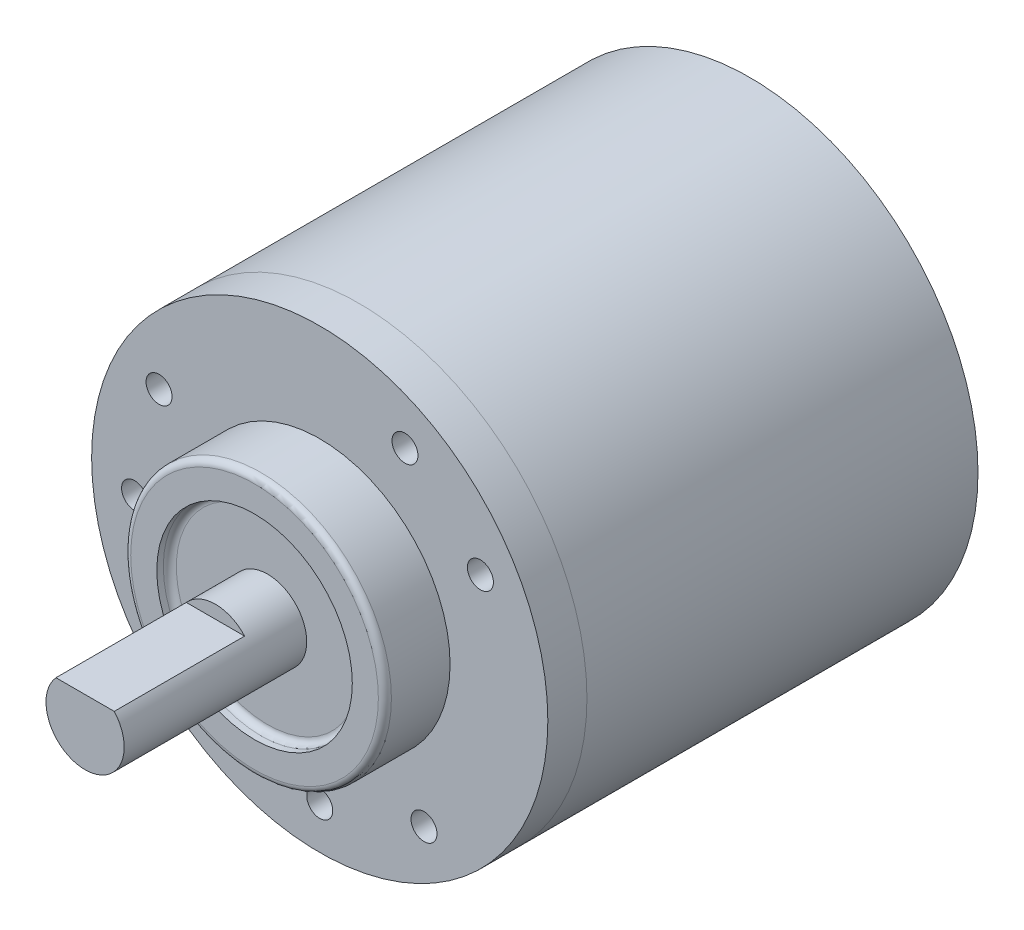
ISO-10303-21;
HEADER;
FILE_DESCRIPTION(('STEP AP214'),'2;1');
FILE_NAME('part.step','',(''),(''),'','','');
FILE_SCHEMA(('AUTOMOTIVE_DESIGN { 1 0 10303 214 1 1 1 1 }'));
ENDSEC;
DATA;
#1=APPLICATION_CONTEXT('core data for automotive mechanical design processes');
#2=APPLICATION_PROTOCOL_DEFINITION('international standard','automotive_design',2000,#1);
#3=PRODUCT_CONTEXT('',#1,'mechanical');
#4=PRODUCT('Part','Part','',(#3));
#5=PRODUCT_RELATED_PRODUCT_CATEGORY('part','',(#4));
#6=PRODUCT_DEFINITION_FORMATION('','',#4);
#7=PRODUCT_DEFINITION_CONTEXT('part definition',#1,'design');
#8=PRODUCT_DEFINITION('design','',#6,#7);
#9=PRODUCT_DEFINITION_SHAPE('','',#8);
#10=(LENGTH_UNIT() NAMED_UNIT(*) SI_UNIT(.MILLI.,.METRE.));
#11=(NAMED_UNIT(*) PLANE_ANGLE_UNIT() SI_UNIT($,.RADIAN.));
#12=(NAMED_UNIT(*) SI_UNIT($,.STERADIAN.) SOLID_ANGLE_UNIT());
#13=UNCERTAINTY_MEASURE_WITH_UNIT(LENGTH_MEASURE(1.E-05),#10,'distance_accuracy_value','');
#14=(GEOMETRIC_REPRESENTATION_CONTEXT(3) GLOBAL_UNCERTAINTY_ASSIGNED_CONTEXT((#13)) GLOBAL_UNIT_ASSIGNED_CONTEXT((#10,
#11,#12)) REPRESENTATION_CONTEXT('',''));
#15=CARTESIAN_POINT('',(0.,0.,0.));
#16=DIRECTION('',(0.,0.,1.));
#17=DIRECTION('',(1.,0.,0.));
#18=AXIS2_PLACEMENT_3D('',#15,#16,#17);
#19=CARTESIAN_POINT('',(0.,0.,37.));
#20=DIRECTION('',(0.,0.,1.));
#21=DIRECTION('',(1.,0.,0.));
#22=AXIS2_PLACEMENT_3D('',#19,#20,#21);
#23=PLANE('',#22);
#24=CARTESIAN_POINT('',(0.,0.,37.));
#25=DIRECTION('',(0.,0.,1.));
#26=DIRECTION('',(1.,0.,0.));
#27=AXIS2_PLACEMENT_3D('',#24,#25,#26);
#28=CIRCLE('',#27,7.);
#29=CARTESIAN_POINT('',(7.,0.,37.));
#30=VERTEX_POINT('',#29);
#31=EDGE_CURVE('E153',#30,#30,#28,.T.);
#32=ORIENTED_EDGE('',*,*,#31,.T.);
#33=EDGE_LOOP('',(#32));
#34=FACE_BOUND('',#33,.T.);
#35=CARTESIAN_POINT('',(0.,0.,37.));
#36=DIRECTION('',(0.,0.,1.));
#37=DIRECTION('',(1.,0.,0.));
#38=AXIS2_PLACEMENT_3D('',#35,#36,#37);
#39=CIRCLE('',#38,3.);
#40=CARTESIAN_POINT('',(3.,0.,37.));
#41=VERTEX_POINT('',#40);
#42=EDGE_CURVE('E84',#41,#41,#39,.T.);
#43=ORIENTED_EDGE('',*,*,#42,.F.);
#44=EDGE_LOOP('',(#43));
#45=FACE_BOUND('',#44,.T.);
#46=ADVANCED_FACE('F49',(#34,#45),#23,.T.);
#47=CARTESIAN_POINT('',(0.,0.,33.));
#48=DIRECTION('',(0.,0.,1.));
#49=DIRECTION('',(1.,0.,0.));
#50=AXIS2_PLACEMENT_3D('',#47,#48,#49);
#51=PLANE('',#50);
#52=CARTESIAN_POINT('',(0.,-14.2329837612549,33.));
#53=DIRECTION('',(0.,0.,1.));
#54=DIRECTION('',(1.,0.,0.));
#55=AXIS2_PLACEMENT_3D('',#52,#53,#54);
#56=CIRCLE('',#55,0.99694999999999);
#57=CARTESIAN_POINT('',(0.99694999999999,-14.2329837612549,33.));
#58=VERTEX_POINT('',#57);
#59=EDGE_CURVE('E354',#58,#58,#56,.T.);
#60=ORIENTED_EDGE('',*,*,#59,.F.);
#61=EDGE_LOOP('',(#60));
#62=FACE_BOUND('',#61,.T.);
#63=CARTESIAN_POINT('',(8.,-11.771908373248,33.));
#64=DIRECTION('',(0.,0.,1.));
#65=DIRECTION('',(1.,0.,0.));
#66=AXIS2_PLACEMENT_3D('',#63,#64,#65);
#67=CIRCLE('',#66,0.99694999999999);
#68=CARTESIAN_POINT('',(8.99694999999999,-11.771908373248,33.));
#69=VERTEX_POINT('',#68);
#70=EDGE_CURVE('E126',#69,#69,#67,.T.);
#71=ORIENTED_EDGE('',*,*,#70,.F.);
#72=EDGE_LOOP('',(#71));
#73=FACE_BOUND('',#72,.T.);
#74=CARTESIAN_POINT('',(12.3261255088982,7.11649188062735,33.));
#75=DIRECTION('',(0.,0.,1.));
#76=DIRECTION('',(1.,0.,0.));
#77=AXIS2_PLACEMENT_3D('',#74,#75,#76);
#78=CIRCLE('',#77,0.99694999999999);
#79=CARTESIAN_POINT('',(13.3230755088982,7.11649188062735,33.));
#80=VERTEX_POINT('',#79);
#81=EDGE_CURVE('E115',#80,#80,#78,.T.);
#82=ORIENTED_EDGE('',*,*,#81,.F.);
#83=EDGE_LOOP('',(#82));
#84=FACE_BOUND('',#83,.T.);
#85=CARTESIAN_POINT('',(6.54025432352957,12.6413171834148,33.));
#86=DIRECTION('',(0.,0.,1.));
#87=DIRECTION('',(1.,0.,0.));
#88=AXIS2_PLACEMENT_3D('',#85,#86,#87);
#89=CIRCLE('',#88,0.99694999999999);
#90=CARTESIAN_POINT('',(7.53720432352956,12.6413171834148,33.));
#91=VERTEX_POINT('',#90);
#92=EDGE_CURVE('E112',#91,#91,#89,.T.);
#93=ORIENTED_EDGE('',*,*,#92,.F.);
#94=EDGE_LOOP('',(#93));
#95=FACE_BOUND('',#94,.T.);
#96=CARTESIAN_POINT('',(-12.3261255088982,7.11649188062734,33.));
#97=DIRECTION('',(0.,0.,1.));
#98=DIRECTION('',(1.,0.,0.));
#99=AXIS2_PLACEMENT_3D('',#96,#97,#98);
#100=CIRCLE('',#99,0.99694999999999);
#101=CARTESIAN_POINT('',(-11.3291755088982,7.11649188062734,33.));
#102=VERTEX_POINT('',#101);
#103=EDGE_CURVE('E111',#102,#102,#100,.T.);
#104=ORIENTED_EDGE('',*,*,#103,.F.);
#105=EDGE_LOOP('',(#104));
#106=FACE_BOUND('',#105,.T.);
#107=CARTESIAN_POINT('',(-14.2055355460873,-0.883508119372653,33.));
#108=DIRECTION('',(0.,0.,1.));
#109=DIRECTION('',(1.,0.,0.));
#110=AXIS2_PLACEMENT_3D('',#107,#108,#109);
#111=CIRCLE('',#110,0.99694999999999);
#112=CARTESIAN_POINT('',(-13.2085855460873,-0.883508119372653,33.));
#113=VERTEX_POINT('',#112);
#114=EDGE_CURVE('E135',#113,#113,#111,.T.);
#115=ORIENTED_EDGE('',*,*,#114,.F.);
#116=EDGE_LOOP('',(#115));
#117=FACE_BOUND('',#116,.T.);
#118=CARTESIAN_POINT('',(0.,0.,33.));
#119=DIRECTION('',(0.,0.,1.));
#120=DIRECTION('',(1.,0.,0.));
#121=AXIS2_PLACEMENT_3D('',#118,#119,#120);
#122=CIRCLE('',#121,17.5);
#123=CARTESIAN_POINT('',(17.5,0.,33.));
#124=VERTEX_POINT('',#123);
#125=EDGE_CURVE('E150',#124,#124,#122,.T.);
#126=ORIENTED_EDGE('',*,*,#125,.T.);
#127=EDGE_LOOP('',(#126));
#128=FACE_BOUND('',#127,.T.);
#129=CARTESIAN_POINT('',(0.,0.,33.));
#130=DIRECTION('',(0.,0.,1.));
#131=DIRECTION('',(1.,0.,0.));
#132=AXIS2_PLACEMENT_3D('',#129,#130,#131);
#133=CIRCLE('',#132,10.);
#134=CARTESIAN_POINT('',(10.,0.,33.));
#135=VERTEX_POINT('',#134);
#136=EDGE_CURVE('E146',#135,#135,#133,.T.);
#137=ORIENTED_EDGE('',*,*,#136,.F.);
#138=EDGE_LOOP('',(#137));
#139=FACE_BOUND('',#138,.T.);
#140=ADVANCED_FACE('F172',(#62,#73,#84,#95,#106,#117,#128,#139),#51,.T.);
#141=CARTESIAN_POINT('',(0.,0.,33.));
#142=DIRECTION('',(0.,0.,-1.));
#143=DIRECTION('',(-1.,0.,0.));
#144=AXIS2_PLACEMENT_3D('',#141,#142,#143);
#145=CYLINDRICAL_SURFACE('',#144,17.5);
#146=ORIENTED_EDGE('',*,*,#125,.F.);
#147=EDGE_LOOP('',(#146));
#148=FACE_BOUND('',#147,.T.);
#149=CARTESIAN_POINT('',(0.,0.,30.));
#150=DIRECTION('',(0.,0.,1.));
#151=DIRECTION('',(1.,0.,0.));
#152=AXIS2_PLACEMENT_3D('',#149,#150,#151);
#153=CIRCLE('',#152,17.5);
#154=CARTESIAN_POINT('',(17.5,0.,30.));
#155=VERTEX_POINT('',#154);
#156=EDGE_CURVE('E149',#155,#155,#153,.T.);
#157=ORIENTED_EDGE('',*,*,#156,.T.);
#158=EDGE_LOOP('',(#157));
#159=FACE_BOUND('',#158,.T.);
#160=ADVANCED_FACE('F196',(#148,#159),#145,.T.);
#161=CARTESIAN_POINT('',(0.,0.,30.));
#162=DIRECTION('',(0.,0.,1.));
#163=DIRECTION('',(1.,0.,0.));
#164=AXIS2_PLACEMENT_3D('',#161,#162,#163);
#165=PLANE('',#164);
#166=CARTESIAN_POINT('',(0.,-14.2329837612549,30.));
#167=DIRECTION('',(0.,0.,1.));
#168=DIRECTION('',(1.,0.,0.));
#169=AXIS2_PLACEMENT_3D('',#166,#167,#168);
#170=CIRCLE('',#169,0.996949999999988);
#171=CARTESIAN_POINT('',(0.996949999999988,-14.2329837612549,30.));
#172=VERTEX_POINT('',#171);
#173=EDGE_CURVE('E53',#172,#172,#170,.T.);
#174=ORIENTED_EDGE('',*,*,#173,.T.);
#175=EDGE_LOOP('',(#174));
#176=FACE_BOUND('',#175,.T.);
#177=CARTESIAN_POINT('',(8.,-11.771908373248,30.));
#178=DIRECTION('',(0.,0.,1.));
#179=DIRECTION('',(1.,0.,0.));
#180=AXIS2_PLACEMENT_3D('',#177,#178,#179);
#181=CIRCLE('',#180,0.996949999999988);
#182=CARTESIAN_POINT('',(8.99694999999999,-11.771908373248,30.));
#183=VERTEX_POINT('',#182);
#184=EDGE_CURVE('E121',#183,#183,#181,.T.);
#185=ORIENTED_EDGE('',*,*,#184,.T.);
#186=EDGE_LOOP('',(#185));
#187=FACE_BOUND('',#186,.T.);
#188=CARTESIAN_POINT('',(12.3261255088982,7.11649188062735,30.));
#189=DIRECTION('',(0.,0.,1.));
#190=DIRECTION('',(1.,0.,0.));
#191=AXIS2_PLACEMENT_3D('',#188,#189,#190);
#192=CIRCLE('',#191,0.996949999999989);
#193=CARTESIAN_POINT('',(13.3230755088982,7.11649188062735,30.));
#194=VERTEX_POINT('',#193);
#195=EDGE_CURVE('E113',#194,#194,#192,.T.);
#196=ORIENTED_EDGE('',*,*,#195,.T.);
#197=EDGE_LOOP('',(#196));
#198=FACE_BOUND('',#197,.T.);
#199=CARTESIAN_POINT('',(6.54025432352957,12.6413171834148,30.));
#200=DIRECTION('',(0.,0.,1.));
#201=DIRECTION('',(1.,0.,0.));
#202=AXIS2_PLACEMENT_3D('',#199,#200,#201);
#203=CIRCLE('',#202,0.996949999999988);
#204=CARTESIAN_POINT('',(7.53720432352956,12.6413171834148,30.));
#205=VERTEX_POINT('',#204);
#206=EDGE_CURVE('E109',#205,#205,#203,.T.);
#207=ORIENTED_EDGE('',*,*,#206,.T.);
#208=EDGE_LOOP('',(#207));
#209=FACE_BOUND('',#208,.T.);
#210=CARTESIAN_POINT('',(-12.3261255088982,7.11649188062734,30.));
#211=DIRECTION('',(0.,0.,1.));
#212=DIRECTION('',(1.,0.,0.));
#213=AXIS2_PLACEMENT_3D('',#210,#211,#212);
#214=CIRCLE('',#213,0.996949999999989);
#215=CARTESIAN_POINT('',(-11.3291755088982,7.11649188062734,30.));
#216=VERTEX_POINT('',#215);
#217=EDGE_CURVE('E132',#216,#216,#214,.T.);
#218=ORIENTED_EDGE('',*,*,#217,.T.);
#219=EDGE_LOOP('',(#218));
#220=FACE_BOUND('',#219,.T.);
#221=CARTESIAN_POINT('',(-14.2055355460873,-0.883508119372653,30.));
#222=DIRECTION('',(0.,0.,1.));
#223=DIRECTION('',(1.,0.,0.));
#224=AXIS2_PLACEMENT_3D('',#221,#222,#223);
#225=CIRCLE('',#224,0.996949999999988);
#226=CARTESIAN_POINT('',(-13.2085855460873,-0.883508119372653,30.));
#227=VERTEX_POINT('',#226);
#228=EDGE_CURVE('E92',#227,#227,#225,.T.);
#229=ORIENTED_EDGE('',*,*,#228,.T.);
#230=EDGE_LOOP('',(#229));
#231=FACE_BOUND('',#230,.T.);
#232=ORIENTED_EDGE('',*,*,#156,.F.);
#233=EDGE_LOOP('',(#232));
#234=FACE_BOUND('',#233,.T.);
#235=ADVANCED_FACE('F192',(#176,#187,#198,#209,#220,#231,#234),#165,.F.);
#236=CARTESIAN_POINT('',(0.,0.,38.));
#237=DIRECTION('',(0.,0.,-1.));
#238=DIRECTION('',(-1.,0.,0.));
#239=AXIS2_PLACEMENT_3D('',#236,#237,#238);
#240=CYLINDRICAL_SURFACE('',#239,10.);
#241=CARTESIAN_POINT('',(0.,0.,37.5));
#242=DIRECTION('',(0.,0.,1.));
#243=DIRECTION('',(1.,0.,0.));
#244=AXIS2_PLACEMENT_3D('',#241,#242,#243);
#245=CIRCLE('',#244,10.);
#246=CARTESIAN_POINT('',(10.,0.,37.5));
#247=VERTEX_POINT('',#246);
#248=EDGE_CURVE('E12',#247,#247,#245,.F.);
#249=ORIENTED_EDGE('',*,*,#248,.T.);
#250=EDGE_LOOP('',(#249));
#251=FACE_BOUND('',#250,.T.);
#252=ORIENTED_EDGE('',*,*,#136,.T.);
#253=EDGE_LOOP('',(#252));
#254=FACE_BOUND('',#253,.T.);
#255=ADVANCED_FACE('F188',(#251,#254),#240,.T.);
#256=CARTESIAN_POINT('',(0.,0.,38.));
#257=DIRECTION('',(0.,0.,1.));
#258=DIRECTION('',(1.,0.,0.));
#259=AXIS2_PLACEMENT_3D('',#256,#257,#258);
#260=PLANE('',#259);
#261=CARTESIAN_POINT('',(0.,0.,38.));
#262=DIRECTION('',(0.,0.,1.));
#263=DIRECTION('',(1.,0.,0.));
#264=AXIS2_PLACEMENT_3D('',#261,#262,#263);
#265=CIRCLE('',#264,9.5);
#266=CARTESIAN_POINT('',(9.5,0.,38.));
#267=VERTEX_POINT('',#266);
#268=EDGE_CURVE('E58',#267,#267,#265,.T.);
#269=ORIENTED_EDGE('',*,*,#268,.T.);
#270=EDGE_LOOP('',(#269));
#271=FACE_BOUND('',#270,.T.);
#272=CARTESIAN_POINT('',(0.,0.,38.));
#273=DIRECTION('',(0.,0.,1.));
#274=DIRECTION('',(1.,0.,0.));
#275=AXIS2_PLACEMENT_3D('',#272,#273,#274);
#276=CIRCLE('',#275,7.5);
#277=CARTESIAN_POINT('',(7.5,0.,38.));
#278=VERTEX_POINT('',#277);
#279=EDGE_CURVE('E83',#278,#278,#276,.T.);
#280=ORIENTED_EDGE('',*,*,#279,.F.);
#281=EDGE_LOOP('',(#280));
#282=FACE_BOUND('',#281,.T.);
#283=ADVANCED_FACE('F185',(#271,#282),#260,.T.);
#284=CARTESIAN_POINT('',(0.,0.,37.));
#285=DIRECTION('',(0.,0.,1.));
#286=DIRECTION('',(1.,0.,0.));
#287=AXIS2_PLACEMENT_3D('',#284,#285,#286);
#288=CYLINDRICAL_SURFACE('',#287,7.5);
#289=CARTESIAN_POINT('',(0.,0.,37.5));
#290=DIRECTION('',(0.,0.,1.));
#291=DIRECTION('',(1.,0.,0.));
#292=AXIS2_PLACEMENT_3D('',#289,#290,#291);
#293=CIRCLE('',#292,7.5);
#294=CARTESIAN_POINT('',(7.5,0.,37.5));
#295=VERTEX_POINT('',#294);
#296=EDGE_CURVE('E107',#295,#295,#293,.F.);
#297=ORIENTED_EDGE('',*,*,#296,.T.);
#298=EDGE_LOOP('',(#297));
#299=FACE_BOUND('',#298,.T.);
#300=ORIENTED_EDGE('',*,*,#279,.T.);
#301=EDGE_LOOP('',(#300));
#302=FACE_BOUND('',#301,.T.);
#303=ADVANCED_FACE('F162',(#299,#302),#288,.F.);
#304=CARTESIAN_POINT('',(0.,0.,37.5));
#305=DIRECTION('',(0.,0.,1.));
#306=DIRECTION('',(1.,0.,0.));
#307=AXIS2_PLACEMENT_3D('',#304,#305,#306);
#308=TOROIDAL_SURFACE('',#307,7.,0.5);
#309=ORIENTED_EDGE('',*,*,#296,.F.);
#310=EDGE_LOOP('',(#309));
#311=FACE_BOUND('',#310,.T.);
#312=ORIENTED_EDGE('',*,*,#31,.F.);
#313=EDGE_LOOP('',(#312));
#314=FACE_BOUND('',#313,.T.);
#315=ADVANCED_FACE('F165',(#311,#314),#308,.F.);
#316=CARTESIAN_POINT('',(0.,0.,41.));
#317=DIRECTION('',(0.,0.,-1.));
#318=DIRECTION('',(-1.,0.,0.));
#319=AXIS2_PLACEMENT_3D('',#316,#317,#318);
#320=CYLINDRICAL_SURFACE('',#319,3.);
#321=CARTESIAN_POINT('',(0.,0.,41.));
#322=DIRECTION('',(0.,0.,1.));
#323=DIRECTION('',(1.,0.,0.));
#324=AXIS2_PLACEMENT_3D('',#321,#322,#323);
#325=CIRCLE('',#324,3.);
#326=CARTESIAN_POINT('',(2.23606797749979,2.,41.));
#327=VERTEX_POINT('',#326);
#328=CARTESIAN_POINT('',(-2.23606797749979,2.,41.));
#329=VERTEX_POINT('',#328);
#330=EDGE_CURVE('E77',#327,#329,#325,.T.);
#331=ORIENTED_EDGE('',*,*,#330,.F.);
#332=DIRECTION('',(0.,0.,-1.));
#333=VECTOR('',#332,1.);
#334=CARTESIAN_POINT('',(2.23606797749979,2.,51.));
#335=LINE('',#334,#333);
#336=CARTESIAN_POINT('',(2.23606797749979,2.,51.));
#337=VERTEX_POINT('',#336);
#338=EDGE_CURVE('E90',#337,#327,#335,.T.);
#339=ORIENTED_EDGE('',*,*,#338,.F.);
#340=CARTESIAN_POINT('',(0.,0.,51.));
#341=DIRECTION('',(0.,0.,1.));
#342=DIRECTION('',(1.,0.,0.));
#343=AXIS2_PLACEMENT_3D('',#340,#341,#342);
#344=CIRCLE('',#343,3.);
#345=CARTESIAN_POINT('',(-2.23606797749979,2.,51.));
#346=VERTEX_POINT('',#345);
#347=EDGE_CURVE('E91',#346,#337,#344,.T.);
#348=ORIENTED_EDGE('',*,*,#347,.F.);
#349=DIRECTION('',(0.,0.,-1.));
#350=VECTOR('',#349,1.);
#351=CARTESIAN_POINT('',(-2.23606797749979,2.,51.));
#352=LINE('',#351,#350);
#353=EDGE_CURVE('E88',#346,#329,#352,.T.);
#354=ORIENTED_EDGE('',*,*,#353,.T.);
#355=EDGE_LOOP('',(#331,#339,#348,#354));
#356=FACE_BOUND('',#355,.T.);
#357=ORIENTED_EDGE('',*,*,#42,.T.);
#358=EDGE_LOOP('',(#357));
#359=FACE_BOUND('',#358,.T.);
#360=ADVANCED_FACE('F94',(#356,#359),#320,.T.);
#361=CARTESIAN_POINT('',(0.,0.,41.));
#362=DIRECTION('',(0.,0.,1.));
#363=DIRECTION('',(1.,0.,0.));
#364=AXIS2_PLACEMENT_3D('',#361,#362,#363);
#365=PLANE('',#364);
#366=DIRECTION('',(-1.,0.,0.));
#367=VECTOR('',#366,1.);
#368=CARTESIAN_POINT('',(-2.23606797749979,2.,41.));
#369=LINE('',#368,#367);
#370=EDGE_CURVE('E65',#327,#329,#369,.T.);
#371=ORIENTED_EDGE('',*,*,#370,.F.);
#372=ORIENTED_EDGE('',*,*,#330,.T.);
#373=EDGE_LOOP('',(#371,#372));
#374=FACE_BOUND('',#373,.T.);
#375=ADVANCED_FACE('F78',(#374),#365,.T.);
#376=CARTESIAN_POINT('',(-2.23606797749979,2.,51.));
#377=DIRECTION('',(0.,-1.,0.));
#378=DIRECTION('',(0.,0.,-1.));
#379=AXIS2_PLACEMENT_3D('',#376,#377,#378);
#380=PLANE('',#379);
#381=ORIENTED_EDGE('',*,*,#370,.T.);
#382=ORIENTED_EDGE('',*,*,#353,.F.);
#383=DIRECTION('',(-1.,0.,0.));
#384=VECTOR('',#383,1.);
#385=CARTESIAN_POINT('',(-2.23606797749979,2.,51.));
#386=LINE('',#385,#384);
#387=EDGE_CURVE('E73',#337,#346,#386,.T.);
#388=ORIENTED_EDGE('',*,*,#387,.F.);
#389=ORIENTED_EDGE('',*,*,#338,.T.);
#390=EDGE_LOOP('',(#381,#382,#388,#389));
#391=FACE_BOUND('',#390,.T.);
#392=ADVANCED_FACE('F87',(#391),#380,.F.);
#393=CARTESIAN_POINT('',(0.,0.,51.));
#394=DIRECTION('',(0.,0.,1.));
#395=DIRECTION('',(1.,0.,0.));
#396=AXIS2_PLACEMENT_3D('',#393,#394,#395);
#397=PLANE('',#396);
#398=ORIENTED_EDGE('',*,*,#347,.T.);
#399=ORIENTED_EDGE('',*,*,#387,.T.);
#400=EDGE_LOOP('',(#398,#399));
#401=FACE_BOUND('',#400,.T.);
#402=ADVANCED_FACE('F263',(#401),#397,.T.);
#403=CARTESIAN_POINT('',(0.,0.,37.5));
#404=DIRECTION('',(0.,0.,1.));
#405=DIRECTION('',(1.,0.,0.));
#406=AXIS2_PLACEMENT_3D('',#403,#404,#405);
#407=TOROIDAL_SURFACE('',#406,9.5,0.5);
#408=ORIENTED_EDGE('',*,*,#248,.F.);
#409=EDGE_LOOP('',(#408));
#410=FACE_BOUND('',#409,.T.);
#411=ORIENTED_EDGE('',*,*,#268,.F.);
#412=EDGE_LOOP('',(#411));
#413=FACE_BOUND('',#412,.T.);
#414=ADVANCED_FACE('F51',(#410,#413),#407,.T.);
#415=CARTESIAN_POINT('',(-14.2055355460873,-0.883508119372653,33.));
#416=DIRECTION('',(0.,0.,1.));
#417=DIRECTION('',(1.,0.,0.));
#418=AXIS2_PLACEMENT_3D('',#415,#416,#417);
#419=CYLINDRICAL_SURFACE('',#418,0.996949999999988);
#420=ORIENTED_EDGE('',*,*,#114,.T.);
#421=EDGE_LOOP('',(#420));
#422=FACE_BOUND('',#421,.T.);
#423=ORIENTED_EDGE('',*,*,#228,.F.);
#424=EDGE_LOOP('',(#423));
#425=FACE_BOUND('',#424,.T.);
#426=ADVANCED_FACE('F278',(#422,#425),#419,.F.);
#427=CARTESIAN_POINT('',(-12.3261255088982,7.11649188062734,33.));
#428=DIRECTION('',(0.,0.,1.));
#429=DIRECTION('',(1.,0.,0.));
#430=AXIS2_PLACEMENT_3D('',#427,#428,#429);
#431=CYLINDRICAL_SURFACE('',#430,0.996949999999989);
#432=ORIENTED_EDGE('',*,*,#103,.T.);
#433=EDGE_LOOP('',(#432));
#434=FACE_BOUND('',#433,.T.);
#435=ORIENTED_EDGE('',*,*,#217,.F.);
#436=EDGE_LOOP('',(#435));
#437=FACE_BOUND('',#436,.T.);
#438=ADVANCED_FACE('F284',(#434,#437),#431,.F.);
#439=CARTESIAN_POINT('',(6.54025432352957,12.6413171834148,33.));
#440=DIRECTION('',(0.,0.,1.));
#441=DIRECTION('',(1.,0.,0.));
#442=AXIS2_PLACEMENT_3D('',#439,#440,#441);
#443=CYLINDRICAL_SURFACE('',#442,0.996949999999988);
#444=ORIENTED_EDGE('',*,*,#92,.T.);
#445=EDGE_LOOP('',(#444));
#446=FACE_BOUND('',#445,.T.);
#447=ORIENTED_EDGE('',*,*,#206,.F.);
#448=EDGE_LOOP('',(#447));
#449=FACE_BOUND('',#448,.T.);
#450=ADVANCED_FACE('F291',(#446,#449),#443,.F.);
#451=CARTESIAN_POINT('',(12.3261255088982,7.11649188062735,33.));
#452=DIRECTION('',(0.,0.,1.));
#453=DIRECTION('',(1.,0.,0.));
#454=AXIS2_PLACEMENT_3D('',#451,#452,#453);
#455=CYLINDRICAL_SURFACE('',#454,0.996949999999989);
#456=ORIENTED_EDGE('',*,*,#81,.T.);
#457=EDGE_LOOP('',(#456));
#458=FACE_BOUND('',#457,.T.);
#459=ORIENTED_EDGE('',*,*,#195,.F.);
#460=EDGE_LOOP('',(#459));
#461=FACE_BOUND('',#460,.T.);
#462=ADVANCED_FACE('F299',(#458,#461),#455,.F.);
#463=CARTESIAN_POINT('',(8.,-11.771908373248,33.));
#464=DIRECTION('',(0.,0.,1.));
#465=DIRECTION('',(1.,0.,0.));
#466=AXIS2_PLACEMENT_3D('',#463,#464,#465);
#467=CYLINDRICAL_SURFACE('',#466,0.996949999999988);
#468=ORIENTED_EDGE('',*,*,#70,.T.);
#469=EDGE_LOOP('',(#468));
#470=FACE_BOUND('',#469,.T.);
#471=ORIENTED_EDGE('',*,*,#184,.F.);
#472=EDGE_LOOP('',(#471));
#473=FACE_BOUND('',#472,.T.);
#474=ADVANCED_FACE('F307',(#470,#473),#467,.F.);
#475=CARTESIAN_POINT('',(0.,-14.2329837612549,33.));
#476=DIRECTION('',(0.,0.,1.));
#477=DIRECTION('',(1.,0.,0.));
#478=AXIS2_PLACEMENT_3D('',#475,#476,#477);
#479=CYLINDRICAL_SURFACE('',#478,0.996949999999988);
#480=ORIENTED_EDGE('',*,*,#59,.T.);
#481=EDGE_LOOP('',(#480));
#482=FACE_BOUND('',#481,.T.);
#483=ORIENTED_EDGE('',*,*,#173,.F.);
#484=EDGE_LOOP('',(#483));
#485=FACE_BOUND('',#484,.T.);
#486=ADVANCED_FACE('F314',(#482,#485),#479,.F.);
#487=CLOSED_SHELL('',(#46,#140,#160,#235,#255,#283,#303,#315,#360,#375,#392,#402,#414,#426,#438,
#450,#462,#474,#486));
#488=MANIFOLD_SOLID_BREP('B2',#487);
#489=CARTESIAN_POINT('',(0.,0.,30.));
#490=DIRECTION('',(0.,0.,-1.));
#491=DIRECTION('',(-1.,0.,0.));
#492=AXIS2_PLACEMENT_3D('',#489,#490,#491);
#493=CYLINDRICAL_SURFACE('',#492,17.5);
#494=CARTESIAN_POINT('',(0.,0.,30.));
#495=DIRECTION('',(0.,0.,1.));
#496=DIRECTION('',(1.,0.,0.));
#497=AXIS2_PLACEMENT_3D('',#494,#495,#496);
#498=CIRCLE('',#497,17.5);
#499=CARTESIAN_POINT('',(17.5,0.,30.));
#500=VERTEX_POINT('',#499);
#501=EDGE_CURVE('E47',#500,#500,#498,.T.);
#502=ORIENTED_EDGE('',*,*,#501,.F.);
#503=EDGE_LOOP('',(#502));
#504=FACE_BOUND('',#503,.T.);
#505=CARTESIAN_POINT('',(0.,0.,0.));
#506=DIRECTION('',(0.,0.,1.));
#507=DIRECTION('',(1.,0.,0.));
#508=AXIS2_PLACEMENT_3D('',#505,#506,#507);
#509=CIRCLE('',#508,17.5);
#510=CARTESIAN_POINT('',(17.5,0.,0.));
#511=VERTEX_POINT('',#510);
#512=EDGE_CURVE('E413',#511,#511,#509,.T.);
#513=ORIENTED_EDGE('',*,*,#512,.T.);
#514=EDGE_LOOP('',(#513));
#515=FACE_BOUND('',#514,.T.);
#516=ADVANCED_FACE('F405',(#504,#515),#493,.T.);
#517=CARTESIAN_POINT('',(0.,0.,30.));
#518=DIRECTION('',(0.,0.,1.));
#519=DIRECTION('',(1.,0.,0.));
#520=AXIS2_PLACEMENT_3D('',#517,#518,#519);
#521=PLANE('',#520);
#522=CARTESIAN_POINT('',(0.,-14.2329837612549,30.));
#523=DIRECTION('',(0.,0.,1.));
#524=DIRECTION('',(1.,0.,0.));
#525=AXIS2_PLACEMENT_3D('',#522,#523,#524);
#526=CIRCLE('',#525,0.996949999999988);
#527=CARTESIAN_POINT('',(0.996949999999988,-14.2329837612549,30.));
#528=VERTEX_POINT('',#527);
#529=EDGE_CURVE('E408',#528,#528,#526,.T.);
#530=ORIENTED_EDGE('',*,*,#529,.F.);
#531=EDGE_LOOP('',(#530));
#532=FACE_BOUND('',#531,.T.);
#533=CARTESIAN_POINT('',(8.,-11.771908373248,30.));
#534=DIRECTION('',(0.,0.,1.));
#535=DIRECTION('',(1.,0.,0.));
#536=AXIS2_PLACEMENT_3D('',#533,#534,#535);
#537=CIRCLE('',#536,0.996949999999988);
#538=CARTESIAN_POINT('',(8.99694999999999,-11.771908373248,30.));
#539=VERTEX_POINT('',#538);
#540=EDGE_CURVE('E449',#539,#539,#537,.T.);
#541=ORIENTED_EDGE('',*,*,#540,.F.);
#542=EDGE_LOOP('',(#541));
#543=FACE_BOUND('',#542,.T.);
#544=CARTESIAN_POINT('',(12.3261255088982,7.11649188062735,30.));
#545=DIRECTION('',(0.,0.,1.));
#546=DIRECTION('',(1.,0.,0.));
#547=AXIS2_PLACEMENT_3D('',#544,#545,#546);
#548=CIRCLE('',#547,0.996949999999989);
#549=CARTESIAN_POINT('',(13.3230755088982,7.11649188062735,30.));
#550=VERTEX_POINT('',#549);
#551=EDGE_CURVE('E453',#550,#550,#548,.T.);
#552=ORIENTED_EDGE('',*,*,#551,.F.);
#553=EDGE_LOOP('',(#552));
#554=FACE_BOUND('',#553,.T.);
#555=CARTESIAN_POINT('',(6.54025432352957,12.6413171834148,30.));
#556=DIRECTION('',(0.,0.,1.));
#557=DIRECTION('',(1.,0.,0.));
#558=AXIS2_PLACEMENT_3D('',#555,#556,#557);
#559=CIRCLE('',#558,0.996949999999988);
#560=CARTESIAN_POINT('',(7.53720432352956,12.6413171834148,30.));
#561=VERTEX_POINT('',#560);
#562=EDGE_CURVE('E457',#561,#561,#559,.T.);
#563=ORIENTED_EDGE('',*,*,#562,.F.);
#564=EDGE_LOOP('',(#563));
#565=FACE_BOUND('',#564,.T.);
#566=CARTESIAN_POINT('',(-12.3261255088982,7.11649188062734,30.));
#567=DIRECTION('',(0.,0.,1.));
#568=DIRECTION('',(1.,0.,0.));
#569=AXIS2_PLACEMENT_3D('',#566,#567,#568);
#570=CIRCLE('',#569,0.996949999999989);
#571=CARTESIAN_POINT('',(-11.3291755088982,7.11649188062734,30.));
#572=VERTEX_POINT('',#571);
#573=EDGE_CURVE('E461',#572,#572,#570,.T.);
#574=ORIENTED_EDGE('',*,*,#573,.F.);
#575=EDGE_LOOP('',(#574));
#576=FACE_BOUND('',#575,.T.);
#577=CARTESIAN_POINT('',(-14.2055355460873,-0.883508119372653,30.));
#578=DIRECTION('',(0.,0.,1.));
#579=DIRECTION('',(1.,0.,0.));
#580=AXIS2_PLACEMENT_3D('',#577,#578,#579);
#581=CIRCLE('',#580,0.996949999999988);
#582=CARTESIAN_POINT('',(-13.2085855460873,-0.883508119372653,30.));
#583=VERTEX_POINT('',#582);
#584=EDGE_CURVE('E464',#583,#583,#581,.T.);
#585=ORIENTED_EDGE('',*,*,#584,.F.);
#586=EDGE_LOOP('',(#585));
#587=FACE_BOUND('',#586,.T.);
#588=ORIENTED_EDGE('',*,*,#501,.T.);
#589=EDGE_LOOP('',(#588));
#590=FACE_BOUND('',#589,.T.);
#591=ADVANCED_FACE('F480',(#532,#543,#554,#565,#576,#587,#590),#521,.T.);
#592=CARTESIAN_POINT('',(0.,0.,0.));
#593=DIRECTION('',(0.,0.,1.));
#594=DIRECTION('',(1.,0.,0.));
#595=AXIS2_PLACEMENT_3D('',#592,#593,#594);
#596=PLANE('',#595);
#597=ORIENTED_EDGE('',*,*,#512,.F.);
#598=EDGE_LOOP('',(#597));
#599=FACE_BOUND('',#598,.T.);
#600=ADVANCED_FACE('F483',(#599),#596,.F.);
#601=CARTESIAN_POINT('',(-14.2055355460873,-0.883508119372653,20.36));
#602=DIRECTION('',(0.,0.,1.));
#603=DIRECTION('',(1.,0.,0.));
#604=AXIS2_PLACEMENT_3D('',#601,#602,#603);
#605=CONICAL_SURFACE('',#604,0.996949999999986,1.02974425867664);
#606=CARTESIAN_POINT('',(-14.2055355460873,-0.883508119372653,19.7609720058605));
#607=VERTEX_POINT('',#606);
#608=VERTEX_LOOP('',#607);
#609=FACE_BOUND('',#608,.T.);
#610=CARTESIAN_POINT('',(-14.2055355460873,-0.883508119372653,20.36));
#611=DIRECTION('',(0.,0.,1.));
#612=DIRECTION('',(1.,0.,0.));
#613=AXIS2_PLACEMENT_3D('',#610,#611,#612);
#614=CIRCLE('',#613,0.996949999999986);
#615=CARTESIAN_POINT('',(-13.2085855460873,-0.883508119372653,20.36));
#616=VERTEX_POINT('',#615);
#617=EDGE_CURVE('E462',#616,#616,#614,.T.);
#618=ORIENTED_EDGE('',*,*,#617,.T.);
#619=EDGE_LOOP('',(#618));
#620=FACE_BOUND('',#619,.T.);
#621=ADVANCED_FACE('F501',(#609,#620),#605,.F.);
#622=CARTESIAN_POINT('',(-14.2055355460873,-0.883508119372653,33.));
#623=DIRECTION('',(0.,0.,1.));
#624=DIRECTION('',(1.,0.,0.));
#625=AXIS2_PLACEMENT_3D('',#622,#623,#624);
#626=CYLINDRICAL_SURFACE('',#625,0.996949999999988);
#627=ORIENTED_EDGE('',*,*,#584,.T.);
#628=EDGE_LOOP('',(#627));
#629=FACE_BOUND('',#628,.T.);
#630=ORIENTED_EDGE('',*,*,#617,.F.);
#631=EDGE_LOOP('',(#630));
#632=FACE_BOUND('',#631,.T.);
#633=ADVANCED_FACE('F505',(#629,#632),#626,.F.);
#634=CARTESIAN_POINT('',(-12.3261255088982,7.11649188062734,20.36));
#635=DIRECTION('',(0.,0.,1.));
#636=DIRECTION('',(1.,0.,0.));
#637=AXIS2_PLACEMENT_3D('',#634,#635,#636);
#638=CONICAL_SURFACE('',#637,0.996949999999988,1.02974425867665);
#639=CARTESIAN_POINT('',(-12.3261255088982,7.11649188062734,19.7609720058605));
#640=VERTEX_POINT('',#639);
#641=VERTEX_LOOP('',#640);
#642=FACE_BOUND('',#641,.T.);
#643=CARTESIAN_POINT('',(-12.3261255088982,7.11649188062734,20.36));
#644=DIRECTION('',(0.,0.,1.));
#645=DIRECTION('',(1.,0.,0.));
#646=AXIS2_PLACEMENT_3D('',#643,#644,#645);
#647=CIRCLE('',#646,0.996949999999988);
#648=CARTESIAN_POINT('',(-11.3291755088982,7.11649188062734,20.36));
#649=VERTEX_POINT('',#648);
#650=EDGE_CURVE('E458',#649,#649,#647,.T.);
#651=ORIENTED_EDGE('',*,*,#650,.T.);
#652=EDGE_LOOP('',(#651));
#653=FACE_BOUND('',#652,.T.);
#654=ADVANCED_FACE('F510',(#642,#653),#638,.F.);
#655=CARTESIAN_POINT('',(-12.3261255088982,7.11649188062734,33.));
#656=DIRECTION('',(0.,0.,1.));
#657=DIRECTION('',(1.,0.,0.));
#658=AXIS2_PLACEMENT_3D('',#655,#656,#657);
#659=CYLINDRICAL_SURFACE('',#658,0.996949999999989);
#660=ORIENTED_EDGE('',*,*,#573,.T.);
#661=EDGE_LOOP('',(#660));
#662=FACE_BOUND('',#661,.T.);
#663=ORIENTED_EDGE('',*,*,#650,.F.);
#664=EDGE_LOOP('',(#663));
#665=FACE_BOUND('',#664,.T.);
#666=ADVANCED_FACE('F514',(#662,#665),#659,.F.);
#667=CARTESIAN_POINT('',(6.54025432352957,12.6413171834148,20.36));
#668=DIRECTION('',(0.,0.,1.));
#669=DIRECTION('',(1.,0.,0.));
#670=AXIS2_PLACEMENT_3D('',#667,#668,#669);
#671=CONICAL_SURFACE('',#670,0.996949999999987,1.02974425867664);
#672=CARTESIAN_POINT('',(6.54025432352956,12.6413171834148,19.7609720058605));
#673=VERTEX_POINT('',#672);
#674=VERTEX_LOOP('',#673);
#675=FACE_BOUND('',#674,.T.);
#676=CARTESIAN_POINT('',(6.54025432352957,12.6413171834148,20.36));
#677=DIRECTION('',(0.,0.,1.));
#678=DIRECTION('',(1.,0.,0.));
#679=AXIS2_PLACEMENT_3D('',#676,#677,#678);
#680=CIRCLE('',#679,0.996949999999987);
#681=CARTESIAN_POINT('',(7.53720432352956,12.6413171834148,20.36));
#682=VERTEX_POINT('',#681);
#683=EDGE_CURVE('E454',#682,#682,#680,.T.);
#684=ORIENTED_EDGE('',*,*,#683,.T.);
#685=EDGE_LOOP('',(#684));
#686=FACE_BOUND('',#685,.T.);
#687=ADVANCED_FACE('F517',(#675,#686),#671,.F.);
#688=CARTESIAN_POINT('',(6.54025432352957,12.6413171834148,33.));
#689=DIRECTION('',(0.,0.,1.));
#690=DIRECTION('',(1.,0.,0.));
#691=AXIS2_PLACEMENT_3D('',#688,#689,#690);
#692=CYLINDRICAL_SURFACE('',#691,0.996949999999988);
#693=ORIENTED_EDGE('',*,*,#562,.T.);
#694=EDGE_LOOP('',(#693));
#695=FACE_BOUND('',#694,.T.);
#696=ORIENTED_EDGE('',*,*,#683,.F.);
#697=EDGE_LOOP('',(#696));
#698=FACE_BOUND('',#697,.T.);
#699=ADVANCED_FACE('F521',(#695,#698),#692,.F.);
#700=CARTESIAN_POINT('',(12.3261255088982,7.11649188062735,20.36));
#701=DIRECTION('',(0.,0.,1.));
#702=DIRECTION('',(1.,0.,0.));
#703=AXIS2_PLACEMENT_3D('',#700,#701,#702);
#704=CONICAL_SURFACE('',#703,0.996949999999988,1.02974425867665);
#705=CARTESIAN_POINT('',(12.3261255088982,7.11649188062735,19.7609720058605));
#706=VERTEX_POINT('',#705);
#707=VERTEX_LOOP('',#706);
#708=FACE_BOUND('',#707,.T.);
#709=CARTESIAN_POINT('',(12.3261255088982,7.11649188062735,20.36));
#710=DIRECTION('',(0.,0.,1.));
#711=DIRECTION('',(1.,0.,0.));
#712=AXIS2_PLACEMENT_3D('',#709,#710,#711);
#713=CIRCLE('',#712,0.996949999999988);
#714=CARTESIAN_POINT('',(13.3230755088982,7.11649188062735,20.36));
#715=VERTEX_POINT('',#714);
#716=EDGE_CURVE('E450',#715,#715,#713,.T.);
#717=ORIENTED_EDGE('',*,*,#716,.T.);
#718=EDGE_LOOP('',(#717));
#719=FACE_BOUND('',#718,.T.);
#720=ADVANCED_FACE('F525',(#708,#719),#704,.F.);
#721=CARTESIAN_POINT('',(12.3261255088982,7.11649188062735,33.));
#722=DIRECTION('',(0.,0.,1.));
#723=DIRECTION('',(1.,0.,0.));
#724=AXIS2_PLACEMENT_3D('',#721,#722,#723);
#725=CYLINDRICAL_SURFACE('',#724,0.996949999999989);
#726=ORIENTED_EDGE('',*,*,#551,.T.);
#727=EDGE_LOOP('',(#726));
#728=FACE_BOUND('',#727,.T.);
#729=ORIENTED_EDGE('',*,*,#716,.F.);
#730=EDGE_LOOP('',(#729));
#731=FACE_BOUND('',#730,.T.);
#732=ADVANCED_FACE('F529',(#728,#731),#725,.F.);
#733=CARTESIAN_POINT('',(8.,-11.771908373248,20.36));
#734=DIRECTION('',(0.,0.,1.));
#735=DIRECTION('',(1.,0.,0.));
#736=AXIS2_PLACEMENT_3D('',#733,#734,#735);
#737=CONICAL_SURFACE('',#736,0.996949999999986,1.02974425867664);
#738=CARTESIAN_POINT('',(8.,-11.771908373248,19.7609720058605));
#739=VERTEX_POINT('',#738);
#740=VERTEX_LOOP('',#739);
#741=FACE_BOUND('',#740,.T.);
#742=CARTESIAN_POINT('',(8.,-11.771908373248,20.36));
#743=DIRECTION('',(0.,0.,1.));
#744=DIRECTION('',(1.,0.,0.));
#745=AXIS2_PLACEMENT_3D('',#742,#743,#744);
#746=CIRCLE('',#745,0.996949999999986);
#747=CARTESIAN_POINT('',(8.99694999999999,-11.771908373248,20.36));
#748=VERTEX_POINT('',#747);
#749=EDGE_CURVE('E445',#748,#748,#746,.T.);
#750=ORIENTED_EDGE('',*,*,#749,.T.);
#751=EDGE_LOOP('',(#750));
#752=FACE_BOUND('',#751,.T.);
#753=ADVANCED_FACE('F533',(#741,#752),#737,.F.);
#754=CARTESIAN_POINT('',(8.,-11.771908373248,33.));
#755=DIRECTION('',(0.,0.,1.));
#756=DIRECTION('',(1.,0.,0.));
#757=AXIS2_PLACEMENT_3D('',#754,#755,#756);
#758=CYLINDRICAL_SURFACE('',#757,0.996949999999988);
#759=ORIENTED_EDGE('',*,*,#540,.T.);
#760=EDGE_LOOP('',(#759));
#761=FACE_BOUND('',#760,.T.);
#762=ORIENTED_EDGE('',*,*,#749,.F.);
#763=EDGE_LOOP('',(#762));
#764=FACE_BOUND('',#763,.T.);
#765=ADVANCED_FACE('F437',(#761,#764),#758,.F.);
#766=CARTESIAN_POINT('',(0.,-14.2329837612549,20.36));
#767=DIRECTION('',(0.,0.,1.));
#768=DIRECTION('',(1.,0.,0.));
#769=AXIS2_PLACEMENT_3D('',#766,#767,#768);
#770=CONICAL_SURFACE('',#769,0.996949999999987,1.02974425867664);
#771=CARTESIAN_POINT('',(0.,-14.2329837612549,19.7609720058605));
#772=VERTEX_POINT('',#771);
#773=VERTEX_LOOP('',#772);
#774=FACE_BOUND('',#773,.T.);
#775=CARTESIAN_POINT('',(0.,-14.2329837612549,20.36));
#776=DIRECTION('',(0.,0.,1.));
#777=DIRECTION('',(1.,0.,0.));
#778=AXIS2_PLACEMENT_3D('',#775,#776,#777);
#779=CIRCLE('',#778,0.996949999999987);
#780=CARTESIAN_POINT('',(0.996949999999987,-14.2329837612549,20.36));
#781=VERTEX_POINT('',#780);
#782=EDGE_CURVE('E441',#781,#781,#779,.T.);
#783=ORIENTED_EDGE('',*,*,#782,.T.);
#784=EDGE_LOOP('',(#783));
#785=FACE_BOUND('',#784,.T.);
#786=ADVANCED_FACE('F433',(#774,#785),#770,.F.);
#787=CARTESIAN_POINT('',(0.,-14.2329837612549,33.));
#788=DIRECTION('',(0.,0.,1.));
#789=DIRECTION('',(1.,0.,0.));
#790=AXIS2_PLACEMENT_3D('',#787,#788,#789);
#791=CYLINDRICAL_SURFACE('',#790,0.996949999999988);
#792=ORIENTED_EDGE('',*,*,#529,.T.);
#793=EDGE_LOOP('',(#792));
#794=FACE_BOUND('',#793,.T.);
#795=ORIENTED_EDGE('',*,*,#782,.F.);
#796=EDGE_LOOP('',(#795));
#797=FACE_BOUND('',#796,.T.);
#798=ADVANCED_FACE('F436',(#794,#797),#791,.F.);
#799=CLOSED_SHELL('',(#516,#591,#600,#621,#633,#654,#666,#687,#699,#720,#732,#753,#765,#786,#798));
#800=MANIFOLD_SOLID_BREP('B6',#799);
#801=ADVANCED_BREP_SHAPE_REPRESENTATION('',(#18,#488,#800),#14);
#802=SHAPE_DEFINITION_REPRESENTATION(#9,#801);
ENDSEC;
END-ISO-10303-21;
